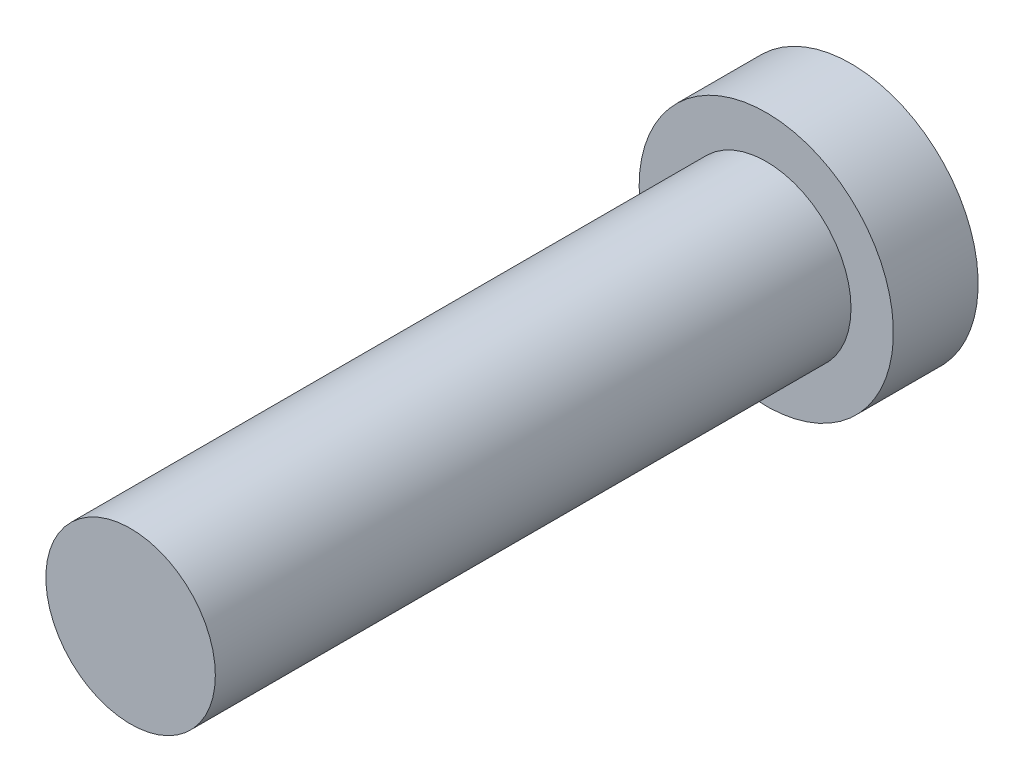
ISO-10303-21;
HEADER;
FILE_DESCRIPTION(('STEP AP214'),'2;1');
FILE_NAME('part.step','',(''),(''),'','','');
FILE_SCHEMA(('AUTOMOTIVE_DESIGN { 1 0 10303 214 1 1 1 1 }'));
ENDSEC;
DATA;
#1=APPLICATION_CONTEXT('core data for automotive mechanical design processes');
#2=APPLICATION_PROTOCOL_DEFINITION('international standard','automotive_design',2000,#1);
#3=PRODUCT_CONTEXT('',#1,'mechanical');
#4=PRODUCT('Part','Part','',(#3));
#5=PRODUCT_RELATED_PRODUCT_CATEGORY('part','',(#4));
#6=PRODUCT_DEFINITION_FORMATION('','',#4);
#7=PRODUCT_DEFINITION_CONTEXT('part definition',#1,'design');
#8=PRODUCT_DEFINITION('design','',#6,#7);
#9=PRODUCT_DEFINITION_SHAPE('','',#8);
#10=(LENGTH_UNIT() NAMED_UNIT(*) SI_UNIT(.MILLI.,.METRE.));
#11=(NAMED_UNIT(*) PLANE_ANGLE_UNIT() SI_UNIT($,.RADIAN.));
#12=(NAMED_UNIT(*) SI_UNIT($,.STERADIAN.) SOLID_ANGLE_UNIT());
#13=UNCERTAINTY_MEASURE_WITH_UNIT(LENGTH_MEASURE(1.E-05),#10,'distance_accuracy_value','');
#14=(GEOMETRIC_REPRESENTATION_CONTEXT(3) GLOBAL_UNCERTAINTY_ASSIGNED_CONTEXT((#13)) GLOBAL_UNIT_ASSIGNED_CONTEXT((#10,
#11,#12)) REPRESENTATION_CONTEXT('',''));
#15=CARTESIAN_POINT('',(0.,0.,0.));
#16=DIRECTION('',(0.,0.,1.));
#17=DIRECTION('',(1.,0.,0.));
#18=AXIS2_PLACEMENT_3D('',#15,#16,#17);
#19=CARTESIAN_POINT('',(0.,0.,75.));
#20=DIRECTION('',(0.,0.,-1.));
#21=DIRECTION('',(-1.,0.,0.));
#22=AXIS2_PLACEMENT_3D('',#19,#20,#21);
#23=CYLINDRICAL_SURFACE('',#22,10.);
#24=CARTESIAN_POINT('',(0.,0.,75.));
#25=DIRECTION('',(0.,0.,1.));
#26=DIRECTION('',(1.,0.,0.));
#27=AXIS2_PLACEMENT_3D('',#24,#25,#26);
#28=CIRCLE('',#27,10.);
#29=CARTESIAN_POINT('',(10.,0.,75.));
#30=VERTEX_POINT('',#29);
#31=EDGE_CURVE('E10',#30,#30,#28,.T.);
#32=ORIENTED_EDGE('',*,*,#31,.F.);
#33=EDGE_LOOP('',(#32));
#34=FACE_BOUND('',#33,.T.);
#35=CARTESIAN_POINT('',(0.,0.,0.));
#36=DIRECTION('',(0.,0.,1.));
#37=DIRECTION('',(1.,0.,0.));
#38=AXIS2_PLACEMENT_3D('',#35,#36,#37);
#39=CIRCLE('',#38,10.);
#40=CARTESIAN_POINT('',(10.,0.,0.));
#41=VERTEX_POINT('',#40);
#42=EDGE_CURVE('E40',#41,#41,#39,.T.);
#43=ORIENTED_EDGE('',*,*,#42,.T.);
#44=EDGE_LOOP('',(#43));
#45=FACE_BOUND('',#44,.T.);
#46=ADVANCED_FACE('F37',(#34,#45),#23,.T.);
#47=CARTESIAN_POINT('',(0.,0.,75.));
#48=DIRECTION('',(0.,0.,1.));
#49=DIRECTION('',(1.,0.,0.));
#50=AXIS2_PLACEMENT_3D('',#47,#48,#49);
#51=PLANE('',#50);
#52=ORIENTED_EDGE('',*,*,#31,.T.);
#53=EDGE_LOOP('',(#52));
#54=FACE_BOUND('',#53,.T.);
#55=ADVANCED_FACE('F64',(#54),#51,.T.);
#56=CARTESIAN_POINT('',(0.,0.,-10.));
#57=DIRECTION('',(0.,0.,1.));
#58=DIRECTION('',(1.,0.,0.));
#59=AXIS2_PLACEMENT_3D('',#56,#57,#58);
#60=CYLINDRICAL_SURFACE('',#59,15.);
#61=CARTESIAN_POINT('',(0.,0.,-10.));
#62=DIRECTION('',(0.,0.,-1.));
#63=DIRECTION('',(-1.,0.,0.));
#64=AXIS2_PLACEMENT_3D('',#61,#62,#63);
#65=CIRCLE('',#64,15.);
#66=CARTESIAN_POINT('',(-15.,0.,-10.));
#67=VERTEX_POINT('',#66);
#68=EDGE_CURVE('E49',#67,#67,#65,.T.);
#69=ORIENTED_EDGE('',*,*,#68,.F.);
#70=EDGE_LOOP('',(#69));
#71=FACE_BOUND('',#70,.T.);
#72=CARTESIAN_POINT('',(0.,0.,0.));
#73=DIRECTION('',(0.,0.,-1.));
#74=DIRECTION('',(-1.,0.,0.));
#75=AXIS2_PLACEMENT_3D('',#72,#73,#74);
#76=CIRCLE('',#75,15.);
#77=CARTESIAN_POINT('',(-15.,0.,0.));
#78=VERTEX_POINT('',#77);
#79=EDGE_CURVE('E51',#78,#78,#76,.T.);
#80=ORIENTED_EDGE('',*,*,#79,.T.);
#81=EDGE_LOOP('',(#80));
#82=FACE_BOUND('',#81,.T.);
#83=ADVANCED_FACE('F61',(#71,#82),#60,.T.);
#84=CARTESIAN_POINT('',(0.,0.,-10.));
#85=DIRECTION('',(0.,0.,-1.));
#86=DIRECTION('',(-1.,0.,0.));
#87=AXIS2_PLACEMENT_3D('',#84,#85,#86);
#88=PLANE('',#87);
#89=ORIENTED_EDGE('',*,*,#68,.T.);
#90=EDGE_LOOP('',(#89));
#91=FACE_BOUND('',#90,.T.);
#92=ADVANCED_FACE('F59',(#91),#88,.T.);
#93=CARTESIAN_POINT('',(0.,0.,0.));
#94=DIRECTION('',(0.,0.,-1.));
#95=DIRECTION('',(-1.,0.,0.));
#96=AXIS2_PLACEMENT_3D('',#93,#94,#95);
#97=PLANE('',#96);
#98=ORIENTED_EDGE('',*,*,#42,.F.);
#99=EDGE_LOOP('',(#98));
#100=FACE_BOUND('',#99,.T.);
#101=ORIENTED_EDGE('',*,*,#79,.F.);
#102=EDGE_LOOP('',(#101));
#103=FACE_BOUND('',#102,.T.);
#104=ADVANCED_FACE('F68',(#100,#103),#97,.F.);
#105=CLOSED_SHELL('',(#46,#55,#83,#92,#104));
#106=MANIFOLD_SOLID_BREP('B2',#105);
#107=ADVANCED_BREP_SHAPE_REPRESENTATION('',(#18,#106),#14);
#108=SHAPE_DEFINITION_REPRESENTATION(#9,#107);
ENDSEC;
END-ISO-10303-21;
